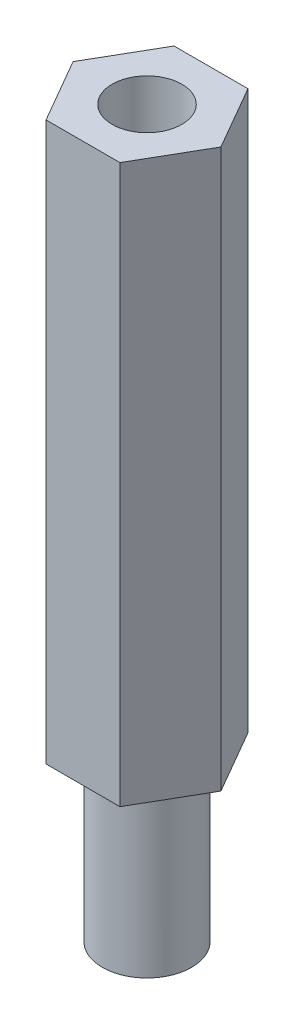
ISO-10303-21;
HEADER;
FILE_DESCRIPTION(('STEP AP214'),'2;1');
FILE_NAME('part.step','',(''),(''),'','','');
FILE_SCHEMA(('AUTOMOTIVE_DESIGN { 1 0 10303 214 1 1 1 1 }'));
ENDSEC;
DATA;
#1=APPLICATION_CONTEXT('core data for automotive mechanical design processes');
#2=APPLICATION_PROTOCOL_DEFINITION('international standard','automotive_design',2000,#1);
#3=PRODUCT_CONTEXT('',#1,'mechanical');
#4=PRODUCT('Part','Part','',(#3));
#5=PRODUCT_RELATED_PRODUCT_CATEGORY('part','',(#4));
#6=PRODUCT_DEFINITION_FORMATION('','',#4);
#7=PRODUCT_DEFINITION_CONTEXT('part definition',#1,'design');
#8=PRODUCT_DEFINITION('design','',#6,#7);
#9=PRODUCT_DEFINITION_SHAPE('','',#8);
#10=(LENGTH_UNIT() NAMED_UNIT(*) SI_UNIT(.MILLI.,.METRE.));
#11=(NAMED_UNIT(*) PLANE_ANGLE_UNIT() SI_UNIT($,.RADIAN.));
#12=(NAMED_UNIT(*) SI_UNIT($,.STERADIAN.) SOLID_ANGLE_UNIT());
#13=UNCERTAINTY_MEASURE_WITH_UNIT(LENGTH_MEASURE(1.E-05),#10,'distance_accuracy_value','');
#14=(GEOMETRIC_REPRESENTATION_CONTEXT(3) GLOBAL_UNCERTAINTY_ASSIGNED_CONTEXT((#13)) GLOBAL_UNIT_ASSIGNED_CONTEXT((#10,
#11,#12)) REPRESENTATION_CONTEXT('',''));
#15=CARTESIAN_POINT('',(0.,0.,0.));
#16=DIRECTION('',(0.,0.,1.));
#17=DIRECTION('',(1.,0.,0.));
#18=AXIS2_PLACEMENT_3D('',#15,#16,#17);
#19=CARTESIAN_POINT('',(-1.325,20.,2.29496732002876));
#20=DIRECTION('',(0.,0.,-1.));
#21=DIRECTION('',(-1.,0.,0.));
#22=AXIS2_PLACEMENT_3D('',#19,#20,#21);
#23=PLANE('',#22);
#24=DIRECTION('',(1.,0.,0.));
#25=VECTOR('',#24,1.);
#26=CARTESIAN_POINT('',(-1.325,0.,2.29496732002876));
#27=LINE('',#26,#25);
#28=CARTESIAN_POINT('',(-1.325,0.,2.29496732002876));
#29=VERTEX_POINT('',#28);
#30=CARTESIAN_POINT('',(1.325,0.,2.29496732002876));
#31=VERTEX_POINT('',#30);
#32=EDGE_CURVE('E122',#29,#31,#27,.T.);
#33=ORIENTED_EDGE('',*,*,#32,.T.);
#34=DIRECTION('',(0.,-1.,0.));
#35=VECTOR('',#34,1.);
#36=CARTESIAN_POINT('',(1.325,20.,2.29496732002876));
#37=LINE('',#36,#35);
#38=CARTESIAN_POINT('',(1.325,20.,2.29496732002876));
#39=VERTEX_POINT('',#38);
#40=EDGE_CURVE('E45',#39,#31,#37,.T.);
#41=ORIENTED_EDGE('',*,*,#40,.F.);
#42=DIRECTION('',(1.,0.,0.));
#43=VECTOR('',#42,1.);
#44=CARTESIAN_POINT('',(-1.325,20.,2.29496732002876));
#45=LINE('',#44,#43);
#46=CARTESIAN_POINT('',(-1.325,20.,2.29496732002876));
#47=VERTEX_POINT('',#46);
#48=EDGE_CURVE('E133',#47,#39,#45,.T.);
#49=ORIENTED_EDGE('',*,*,#48,.F.);
#50=DIRECTION('',(0.,-1.,0.));
#51=VECTOR('',#50,1.);
#52=CARTESIAN_POINT('',(-1.325,20.,2.29496732002876));
#53=LINE('',#52,#51);
#54=EDGE_CURVE('E118',#47,#29,#53,.T.);
#55=ORIENTED_EDGE('',*,*,#54,.T.);
#56=EDGE_LOOP('',(#33,#41,#49,#55));
#57=FACE_BOUND('',#56,.T.);
#58=ADVANCED_FACE('F37',(#57),#23,.F.);
#59=CARTESIAN_POINT('',(1.325,20.,2.29496732002876));
#60=DIRECTION('',(-0.866025403784439,0.,-0.5));
#61=DIRECTION('',(-0.5,0.,0.866025403784439));
#62=AXIS2_PLACEMENT_3D('',#59,#60,#61);
#63=PLANE('',#62);
#64=DIRECTION('',(0.5,0.,-0.866025403784439));
#65=VECTOR('',#64,1.);
#66=CARTESIAN_POINT('',(1.325,0.,2.29496732002876));
#67=LINE('',#66,#65);
#68=CARTESIAN_POINT('',(2.65,0.,0.));
#69=VERTEX_POINT('',#68);
#70=EDGE_CURVE('E125',#31,#69,#67,.T.);
#71=ORIENTED_EDGE('',*,*,#70,.T.);
#72=DIRECTION('',(0.,-1.,0.));
#73=VECTOR('',#72,1.);
#74=CARTESIAN_POINT('',(2.65,20.,0.));
#75=LINE('',#74,#73);
#76=CARTESIAN_POINT('',(2.65,20.,0.));
#77=VERTEX_POINT('',#76);
#78=EDGE_CURVE('E137',#77,#69,#75,.T.);
#79=ORIENTED_EDGE('',*,*,#78,.F.);
#80=DIRECTION('',(0.5,0.,-0.866025403784439));
#81=VECTOR('',#80,1.);
#82=CARTESIAN_POINT('',(1.325,20.,2.29496732002876));
#83=LINE('',#82,#81);
#84=EDGE_CURVE('E91',#39,#77,#83,.T.);
#85=ORIENTED_EDGE('',*,*,#84,.F.);
#86=ORIENTED_EDGE('',*,*,#40,.T.);
#87=EDGE_LOOP('',(#71,#79,#85,#86));
#88=FACE_BOUND('',#87,.T.);
#89=ADVANCED_FACE('F140',(#88),#63,.F.);
#90=CARTESIAN_POINT('',(2.65,20.,0.));
#91=DIRECTION('',(-0.866025403784438,0.,0.5));
#92=DIRECTION('',(0.5,0.,0.866025403784439));
#93=AXIS2_PLACEMENT_3D('',#90,#91,#92);
#94=PLANE('',#93);
#95=DIRECTION('',(-0.5,0.,-0.866025403784439));
#96=VECTOR('',#95,1.);
#97=CARTESIAN_POINT('',(2.65,0.,0.));
#98=LINE('',#97,#96);
#99=CARTESIAN_POINT('',(1.325,0.,-2.29496732002876));
#100=VERTEX_POINT('',#99);
#101=EDGE_CURVE('E128',#69,#100,#98,.T.);
#102=ORIENTED_EDGE('',*,*,#101,.T.);
#103=DIRECTION('',(0.,-1.,0.));
#104=VECTOR('',#103,1.);
#105=CARTESIAN_POINT('',(1.325,20.,-2.29496732002876));
#106=LINE('',#105,#104);
#107=CARTESIAN_POINT('',(1.325,20.,-2.29496732002876));
#108=VERTEX_POINT('',#107);
#109=EDGE_CURVE('E113',#108,#100,#106,.T.);
#110=ORIENTED_EDGE('',*,*,#109,.F.);
#111=DIRECTION('',(-0.5,0.,-0.866025403784439));
#112=VECTOR('',#111,1.);
#113=CARTESIAN_POINT('',(2.65,20.,0.));
#114=LINE('',#113,#112);
#115=EDGE_CURVE('E104',#77,#108,#114,.T.);
#116=ORIENTED_EDGE('',*,*,#115,.F.);
#117=ORIENTED_EDGE('',*,*,#78,.T.);
#118=EDGE_LOOP('',(#102,#110,#116,#117));
#119=FACE_BOUND('',#118,.T.);
#120=ADVANCED_FACE('F148',(#119),#94,.F.);
#121=CARTESIAN_POINT('',(1.325,20.,-2.29496732002876));
#122=DIRECTION('',(0.,0.,1.));
#123=DIRECTION('',(1.,0.,0.));
#124=AXIS2_PLACEMENT_3D('',#121,#122,#123);
#125=PLANE('',#124);
#126=DIRECTION('',(-1.,0.,0.));
#127=VECTOR('',#126,1.);
#128=CARTESIAN_POINT('',(1.325,0.,-2.29496732002876));
#129=LINE('',#128,#127);
#130=CARTESIAN_POINT('',(-1.325,0.,-2.29496732002876));
#131=VERTEX_POINT('',#130);
#132=EDGE_CURVE('E112',#100,#131,#129,.T.);
#133=ORIENTED_EDGE('',*,*,#132,.T.);
#134=DIRECTION('',(0.,-1.,0.));
#135=VECTOR('',#134,1.);
#136=CARTESIAN_POINT('',(-1.325,20.,-2.29496732002876));
#137=LINE('',#136,#135);
#138=CARTESIAN_POINT('',(-1.325,20.,-2.29496732002876));
#139=VERTEX_POINT('',#138);
#140=EDGE_CURVE('E109',#139,#131,#137,.T.);
#141=ORIENTED_EDGE('',*,*,#140,.F.);
#142=DIRECTION('',(-1.,0.,0.));
#143=VECTOR('',#142,1.);
#144=CARTESIAN_POINT('',(1.325,20.,-2.29496732002876));
#145=LINE('',#144,#143);
#146=EDGE_CURVE('E98',#108,#139,#145,.T.);
#147=ORIENTED_EDGE('',*,*,#146,.F.);
#148=ORIENTED_EDGE('',*,*,#109,.T.);
#149=EDGE_LOOP('',(#133,#141,#147,#148));
#150=FACE_BOUND('',#149,.T.);
#151=ADVANCED_FACE('F110',(#150),#125,.F.);
#152=CARTESIAN_POINT('',(-1.325,20.,-2.29496732002876));
#153=DIRECTION('',(0.866025403784439,0.,0.5));
#154=DIRECTION('',(0.5,0.,-0.866025403784439));
#155=AXIS2_PLACEMENT_3D('',#152,#153,#154);
#156=PLANE('',#155);
#157=DIRECTION('',(-0.5,0.,0.866025403784439));
#158=VECTOR('',#157,1.);
#159=CARTESIAN_POINT('',(-1.325,0.,-2.29496732002876));
#160=LINE('',#159,#158);
#161=CARTESIAN_POINT('',(-2.65,0.,0.));
#162=VERTEX_POINT('',#161);
#163=EDGE_CURVE('E76',#131,#162,#160,.T.);
#164=ORIENTED_EDGE('',*,*,#163,.T.);
#165=DIRECTION('',(0.,-1.,0.));
#166=VECTOR('',#165,1.);
#167=CARTESIAN_POINT('',(-2.65,20.,0.));
#168=LINE('',#167,#166);
#169=CARTESIAN_POINT('',(-2.65,20.,0.));
#170=VERTEX_POINT('',#169);
#171=EDGE_CURVE('E114',#170,#162,#168,.T.);
#172=ORIENTED_EDGE('',*,*,#171,.F.);
#173=DIRECTION('',(-0.5,0.,0.866025403784439));
#174=VECTOR('',#173,1.);
#175=CARTESIAN_POINT('',(-1.325,20.,-2.29496732002876));
#176=LINE('',#175,#174);
#177=EDGE_CURVE('E102',#139,#170,#176,.T.);
#178=ORIENTED_EDGE('',*,*,#177,.F.);
#179=ORIENTED_EDGE('',*,*,#140,.T.);
#180=EDGE_LOOP('',(#164,#172,#178,#179));
#181=FACE_BOUND('',#180,.T.);
#182=ADVANCED_FACE('F116',(#181),#156,.F.);
#183=CARTESIAN_POINT('',(-2.65,20.,0.));
#184=DIRECTION('',(0.866025403784438,0.,-0.5));
#185=DIRECTION('',(-0.5,0.,-0.866025403784439));
#186=AXIS2_PLACEMENT_3D('',#183,#184,#185);
#187=PLANE('',#186);
#188=DIRECTION('',(0.5,0.,0.866025403784439));
#189=VECTOR('',#188,1.);
#190=CARTESIAN_POINT('',(-2.65,0.,0.));
#191=LINE('',#190,#189);
#192=EDGE_CURVE('E82',#162,#29,#191,.T.);
#193=ORIENTED_EDGE('',*,*,#192,.T.);
#194=ORIENTED_EDGE('',*,*,#54,.F.);
#195=DIRECTION('',(0.5,0.,0.866025403784439));
#196=VECTOR('',#195,1.);
#197=CARTESIAN_POINT('',(-2.65,20.,0.));
#198=LINE('',#197,#196);
#199=EDGE_CURVE('E53',#170,#47,#198,.T.);
#200=ORIENTED_EDGE('',*,*,#199,.F.);
#201=ORIENTED_EDGE('',*,*,#171,.T.);
#202=EDGE_LOOP('',(#193,#194,#200,#201));
#203=FACE_BOUND('',#202,.T.);
#204=ADVANCED_FACE('F171',(#203),#187,.F.);
#205=CARTESIAN_POINT('',(0.,20.,0.));
#206=DIRECTION('',(0.,1.,0.));
#207=DIRECTION('',(0.,0.,1.));
#208=AXIS2_PLACEMENT_3D('',#205,#206,#207);
#209=PLANE('',#208);
#210=CARTESIAN_POINT('',(0.,20.,0.));
#211=DIRECTION('',(0.,1.,0.));
#212=DIRECTION('',(0.,0.,1.));
#213=AXIS2_PLACEMENT_3D('',#210,#211,#212);
#214=CIRCLE('',#213,1.25);
#215=CARTESIAN_POINT('',(0.,20.,1.25));
#216=VERTEX_POINT('',#215);
#217=EDGE_CURVE('E155',#216,#216,#214,.T.);
#218=ORIENTED_EDGE('',*,*,#217,.F.);
#219=EDGE_LOOP('',(#218));
#220=FACE_BOUND('',#219,.T.);
#221=ORIENTED_EDGE('',*,*,#48,.T.);
#222=ORIENTED_EDGE('',*,*,#84,.T.);
#223=ORIENTED_EDGE('',*,*,#115,.T.);
#224=ORIENTED_EDGE('',*,*,#146,.T.);
#225=ORIENTED_EDGE('',*,*,#177,.T.);
#226=ORIENTED_EDGE('',*,*,#199,.T.);
#227=EDGE_LOOP('',(#221,#222,#223,#224,#225,#226));
#228=FACE_BOUND('',#227,.T.);
#229=ADVANCED_FACE('F100',(#220,#228),#209,.T.);
#230=CARTESIAN_POINT('',(0.,0.,0.));
#231=DIRECTION('',(0.,1.,0.));
#232=DIRECTION('',(0.,0.,1.));
#233=AXIS2_PLACEMENT_3D('',#230,#231,#232);
#234=PLANE('',#233);
#235=CARTESIAN_POINT('',(0.,0.,0.));
#236=DIRECTION('',(0.,1.,0.));
#237=DIRECTION('',(0.,0.,1.));
#238=AXIS2_PLACEMENT_3D('',#235,#236,#237);
#239=CIRCLE('',#238,1.6);
#240=CARTESIAN_POINT('',(0.,0.,1.6));
#241=VERTEX_POINT('',#240);
#242=EDGE_CURVE('E11',#241,#241,#239,.F.);
#243=ORIENTED_EDGE('',*,*,#242,.F.);
#244=EDGE_LOOP('',(#243));
#245=FACE_BOUND('',#244,.T.);
#246=ORIENTED_EDGE('',*,*,#32,.F.);
#247=ORIENTED_EDGE('',*,*,#192,.F.);
#248=ORIENTED_EDGE('',*,*,#163,.F.);
#249=ORIENTED_EDGE('',*,*,#132,.F.);
#250=ORIENTED_EDGE('',*,*,#101,.F.);
#251=ORIENTED_EDGE('',*,*,#70,.F.);
#252=EDGE_LOOP('',(#246,#247,#248,#249,#250,#251));
#253=FACE_BOUND('',#252,.T.);
#254=ADVANCED_FACE('F145',(#245,#253),#234,.F.);
#255=CARTESIAN_POINT('',(0.,-6.,0.));
#256=DIRECTION('',(0.,1.,0.));
#257=DIRECTION('',(0.,0.,1.));
#258=AXIS2_PLACEMENT_3D('',#255,#256,#257);
#259=CYLINDRICAL_SURFACE('',#258,1.6);
#260=CARTESIAN_POINT('',(0.,-6.,0.));
#261=DIRECTION('',(0.,-1.,0.));
#262=DIRECTION('',(0.,0.,-1.));
#263=AXIS2_PLACEMENT_3D('',#260,#261,#262);
#264=CIRCLE('',#263,1.6);
#265=CARTESIAN_POINT('',(0.,-6.,-1.6));
#266=VERTEX_POINT('',#265);
#267=EDGE_CURVE('E126',#266,#266,#264,.T.);
#268=ORIENTED_EDGE('',*,*,#267,.F.);
#269=EDGE_LOOP('',(#268));
#270=FACE_BOUND('',#269,.T.);
#271=ORIENTED_EDGE('',*,*,#242,.T.);
#272=EDGE_LOOP('',(#271));
#273=FACE_BOUND('',#272,.T.);
#274=ADVANCED_FACE('F177',(#270,#273),#259,.T.);
#275=CARTESIAN_POINT('',(0.,-6.,0.));
#276=DIRECTION('',(0.,-1.,0.));
#277=DIRECTION('',(0.,0.,-1.));
#278=AXIS2_PLACEMENT_3D('',#275,#276,#277);
#279=PLANE('',#278);
#280=ORIENTED_EDGE('',*,*,#267,.T.);
#281=EDGE_LOOP('',(#280));
#282=FACE_BOUND('',#281,.T.);
#283=ADVANCED_FACE('F166',(#282),#279,.T.);
#284=CARTESIAN_POINT('',(0.,15.,0.));
#285=DIRECTION('',(0.,1.,0.));
#286=DIRECTION('',(0.,0.,1.));
#287=AXIS2_PLACEMENT_3D('',#284,#285,#286);
#288=CYLINDRICAL_SURFACE('',#287,1.25);
#289=CARTESIAN_POINT('',(0.,15.,0.));
#290=DIRECTION('',(0.,1.,0.));
#291=DIRECTION('',(0.,0.,1.));
#292=AXIS2_PLACEMENT_3D('',#289,#290,#291);
#293=CIRCLE('',#292,1.25);
#294=CARTESIAN_POINT('',(0.,15.,1.25));
#295=VERTEX_POINT('',#294);
#296=EDGE_CURVE('E154',#295,#295,#293,.T.);
#297=ORIENTED_EDGE('',*,*,#296,.F.);
#298=EDGE_LOOP('',(#297));
#299=FACE_BOUND('',#298,.T.);
#300=ORIENTED_EDGE('',*,*,#217,.T.);
#301=EDGE_LOOP('',(#300));
#302=FACE_BOUND('',#301,.T.);
#303=ADVANCED_FACE('F163',(#299,#302),#288,.F.);
#304=CARTESIAN_POINT('',(0.,15.,0.));
#305=DIRECTION('',(0.,1.,0.));
#306=DIRECTION('',(0.,0.,1.));
#307=AXIS2_PLACEMENT_3D('',#304,#305,#306);
#308=PLANE('',#307);
#309=ORIENTED_EDGE('',*,*,#296,.T.);
#310=EDGE_LOOP('',(#309));
#311=FACE_BOUND('',#310,.T.);
#312=ADVANCED_FACE('F161',(#311),#308,.T.);
#313=CLOSED_SHELL('',(#58,#89,#120,#151,#182,#204,#229,#254,#274,#283,#303,#312));
#314=MANIFOLD_SOLID_BREP('B2',#313);
#315=ADVANCED_BREP_SHAPE_REPRESENTATION('',(#18,#314),#14);
#316=SHAPE_DEFINITION_REPRESENTATION(#9,#315);
ENDSEC;
END-ISO-10303-21;
